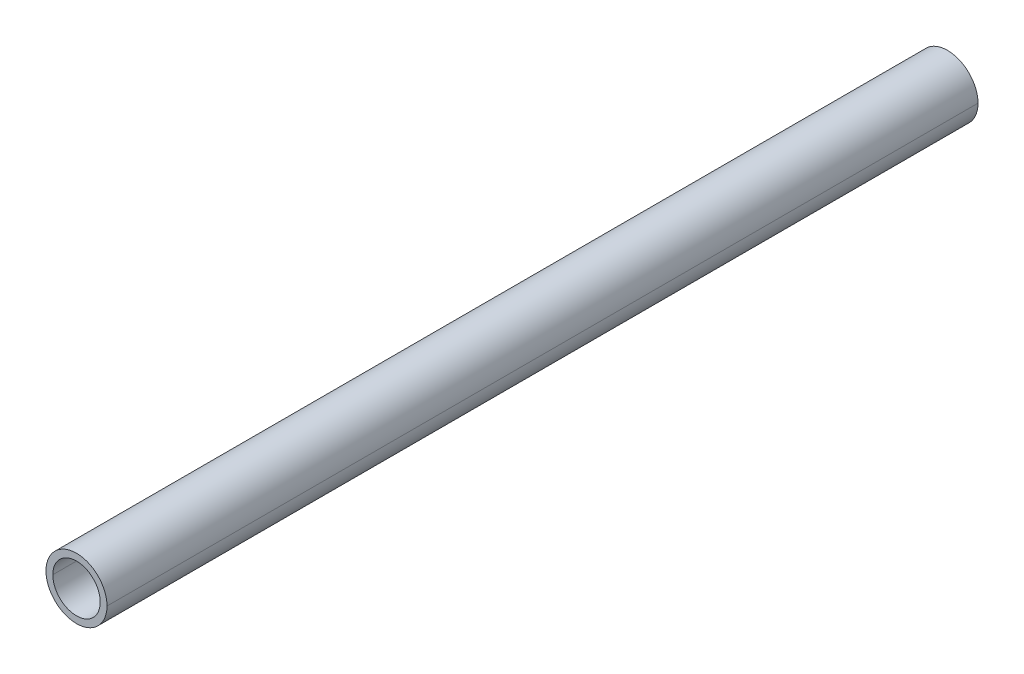
ISO-10303-21;
HEADER;
FILE_DESCRIPTION(('STEP AP214'),'2;1');
FILE_NAME('part.step','',(''),(''),'','','');
FILE_SCHEMA(('AUTOMOTIVE_DESIGN { 1 0 10303 214 1 1 1 1 }'));
ENDSEC;
DATA;
#1=APPLICATION_CONTEXT('core data for automotive mechanical design processes');
#2=APPLICATION_PROTOCOL_DEFINITION('international standard','automotive_design',2000,#1);
#3=PRODUCT_CONTEXT('',#1,'mechanical');
#4=PRODUCT('Part','Part','',(#3));
#5=PRODUCT_RELATED_PRODUCT_CATEGORY('part','',(#4));
#6=PRODUCT_DEFINITION_FORMATION('','',#4);
#7=PRODUCT_DEFINITION_CONTEXT('part definition',#1,'design');
#8=PRODUCT_DEFINITION('design','',#6,#7);
#9=PRODUCT_DEFINITION_SHAPE('','',#8);
#10=(LENGTH_UNIT() NAMED_UNIT(*) SI_UNIT(.MILLI.,.METRE.));
#11=(NAMED_UNIT(*) PLANE_ANGLE_UNIT() SI_UNIT($,.RADIAN.));
#12=(NAMED_UNIT(*) SI_UNIT($,.STERADIAN.) SOLID_ANGLE_UNIT());
#13=UNCERTAINTY_MEASURE_WITH_UNIT(LENGTH_MEASURE(1.E-05),#10,'distance_accuracy_value','');
#14=(GEOMETRIC_REPRESENTATION_CONTEXT(3) GLOBAL_UNCERTAINTY_ASSIGNED_CONTEXT((#13)) GLOBAL_UNIT_ASSIGNED_CONTEXT((#10,
#11,#12)) REPRESENTATION_CONTEXT('',''));
#15=CARTESIAN_POINT('',(0.,0.,0.));
#16=DIRECTION('',(0.,0.,1.));
#17=DIRECTION('',(1.,0.,0.));
#18=AXIS2_PLACEMENT_3D('',#15,#16,#17);
#19=CARTESIAN_POINT('',(0.,0.,257.));
#20=DIRECTION('',(0.,0.,-1.));
#21=DIRECTION('',(-1.,0.,0.));
#22=AXIS2_PLACEMENT_3D('',#19,#20,#21);
#23=CYLINDRICAL_SURFACE('',#22,7.);
#24=DIRECTION('',(0.,0.,-1.));
#25=VECTOR('',#24,1.);
#26=CARTESIAN_POINT('',(7.,0.,257.));
#27=LINE('',#26,#25);
#28=CARTESIAN_POINT('',(7.,0.,257.));
#29=VERTEX_POINT('',#28);
#30=CARTESIAN_POINT('',(7.,0.,0.));
#31=VERTEX_POINT('',#30);
#32=EDGE_CURVE('E73',#29,#31,#27,.T.);
#33=ORIENTED_EDGE('',*,*,#32,.F.);
#34=CARTESIAN_POINT('',(0.,0.,257.));
#35=DIRECTION('',(0.,0.,1.));
#36=DIRECTION('',(1.,0.,0.));
#37=AXIS2_PLACEMENT_3D('',#34,#35,#36);
#38=CIRCLE('',#37,7.);
#39=CARTESIAN_POINT('',(-7.,0.,257.));
#40=VERTEX_POINT('',#39);
#41=EDGE_CURVE('E101',#29,#40,#38,.T.);
#42=ORIENTED_EDGE('',*,*,#41,.T.);
#43=DIRECTION('',(0.,0.,-1.));
#44=VECTOR('',#43,1.);
#45=CARTESIAN_POINT('',(-7.,0.,257.));
#46=LINE('',#45,#44);
#47=CARTESIAN_POINT('',(-7.,0.,0.));
#48=VERTEX_POINT('',#47);
#49=EDGE_CURVE('E76',#40,#48,#46,.T.);
#50=ORIENTED_EDGE('',*,*,#49,.T.);
#51=CARTESIAN_POINT('',(0.,0.,0.));
#52=DIRECTION('',(0.,0.,1.));
#53=DIRECTION('',(1.,0.,0.));
#54=AXIS2_PLACEMENT_3D('',#51,#52,#53);
#55=CIRCLE('',#54,7.);
#56=EDGE_CURVE('E11',#31,#48,#55,.T.);
#57=ORIENTED_EDGE('',*,*,#56,.F.);
#58=EDGE_LOOP('',(#33,#42,#50,#57));
#59=FACE_BOUND('',#58,.T.);
#60=ADVANCED_FACE('F16',(#59),#23,.F.);
#61=CARTESIAN_POINT('',(0.,0.,257.));
#62=DIRECTION('',(0.,0.,-1.));
#63=DIRECTION('',(-1.,0.,0.));
#64=AXIS2_PLACEMENT_3D('',#61,#62,#63);
#65=CYLINDRICAL_SURFACE('',#64,9.);
#66=DIRECTION('',(0.,0.,-1.));
#67=VECTOR('',#66,1.);
#68=CARTESIAN_POINT('',(9.,0.,257.));
#69=LINE('',#68,#67);
#70=CARTESIAN_POINT('',(9.,0.,257.));
#71=VERTEX_POINT('',#70);
#72=CARTESIAN_POINT('',(9.,0.,0.));
#73=VERTEX_POINT('',#72);
#74=EDGE_CURVE('E96',#71,#73,#69,.T.);
#75=ORIENTED_EDGE('',*,*,#74,.F.);
#76=CARTESIAN_POINT('',(0.,0.,257.));
#77=DIRECTION('',(0.,0.,1.));
#78=DIRECTION('',(1.,0.,0.));
#79=AXIS2_PLACEMENT_3D('',#76,#77,#78);
#80=CIRCLE('',#79,9.);
#81=CARTESIAN_POINT('',(-9.,0.,257.));
#82=VERTEX_POINT('',#81);
#83=EDGE_CURVE('E104',#82,#71,#80,.T.);
#84=ORIENTED_EDGE('',*,*,#83,.F.);
#85=DIRECTION('',(0.,0.,-1.));
#86=VECTOR('',#85,1.);
#87=CARTESIAN_POINT('',(-9.,0.,257.));
#88=LINE('',#87,#86);
#89=CARTESIAN_POINT('',(-9.,0.,0.));
#90=VERTEX_POINT('',#89);
#91=EDGE_CURVE('E20',#82,#90,#88,.T.);
#92=ORIENTED_EDGE('',*,*,#91,.T.);
#93=CARTESIAN_POINT('',(0.,0.,0.));
#94=DIRECTION('',(0.,0.,1.));
#95=DIRECTION('',(1.,0.,0.));
#96=AXIS2_PLACEMENT_3D('',#93,#94,#95);
#97=CIRCLE('',#96,9.);
#98=EDGE_CURVE('E27',#90,#73,#97,.T.);
#99=ORIENTED_EDGE('',*,*,#98,.T.);
#100=EDGE_LOOP('',(#75,#84,#92,#99));
#101=FACE_BOUND('',#100,.T.);
#102=ADVANCED_FACE('F117',(#101),#65,.T.);
#103=CARTESIAN_POINT('',(0.,0.,0.));
#104=DIRECTION('',(0.,0.,1.));
#105=DIRECTION('',(1.,0.,0.));
#106=AXIS2_PLACEMENT_3D('',#103,#104,#105);
#107=PLANE('',#106);
#108=CARTESIAN_POINT('',(0.,0.,0.));
#109=DIRECTION('',(0.,0.,1.));
#110=DIRECTION('',(1.,0.,0.));
#111=AXIS2_PLACEMENT_3D('',#108,#109,#110);
#112=CIRCLE('',#111,7.);
#113=EDGE_CURVE('E78',#48,#31,#112,.T.);
#114=ORIENTED_EDGE('',*,*,#113,.T.);
#115=ORIENTED_EDGE('',*,*,#56,.T.);
#116=EDGE_LOOP('',(#114,#115));
#117=FACE_BOUND('',#116,.T.);
#118=ORIENTED_EDGE('',*,*,#98,.F.);
#119=CARTESIAN_POINT('',(0.,0.,0.));
#120=DIRECTION('',(0.,0.,1.));
#121=DIRECTION('',(1.,0.,0.));
#122=AXIS2_PLACEMENT_3D('',#119,#120,#121);
#123=CIRCLE('',#122,9.);
#124=EDGE_CURVE('E100',#73,#90,#123,.T.);
#125=ORIENTED_EDGE('',*,*,#124,.F.);
#126=EDGE_LOOP('',(#118,#125));
#127=FACE_BOUND('',#126,.T.);
#128=ADVANCED_FACE('F79',(#117,#127),#107,.F.);
#129=CARTESIAN_POINT('',(0.,0.,257.));
#130=DIRECTION('',(0.,0.,1.));
#131=DIRECTION('',(1.,0.,0.));
#132=AXIS2_PLACEMENT_3D('',#129,#130,#131);
#133=PLANE('',#132);
#134=CARTESIAN_POINT('',(0.,0.,257.));
#135=DIRECTION('',(0.,0.,1.));
#136=DIRECTION('',(1.,0.,0.));
#137=AXIS2_PLACEMENT_3D('',#134,#135,#136);
#138=CIRCLE('',#137,7.);
#139=EDGE_CURVE('E84',#40,#29,#138,.T.);
#140=ORIENTED_EDGE('',*,*,#139,.F.);
#141=ORIENTED_EDGE('',*,*,#41,.F.);
#142=EDGE_LOOP('',(#140,#141));
#143=FACE_BOUND('',#142,.T.);
#144=ORIENTED_EDGE('',*,*,#83,.T.);
#145=CARTESIAN_POINT('',(0.,0.,257.));
#146=DIRECTION('',(0.,0.,1.));
#147=DIRECTION('',(1.,0.,0.));
#148=AXIS2_PLACEMENT_3D('',#145,#146,#147);
#149=CIRCLE('',#148,9.);
#150=EDGE_CURVE('E93',#71,#82,#149,.T.);
#151=ORIENTED_EDGE('',*,*,#150,.T.);
#152=EDGE_LOOP('',(#144,#151));
#153=FACE_BOUND('',#152,.T.);
#154=ADVANCED_FACE('F122',(#143,#153),#133,.T.);
#155=CARTESIAN_POINT('',(0.,0.,257.));
#156=DIRECTION('',(0.,0.,-1.));
#157=DIRECTION('',(-1.,0.,0.));
#158=AXIS2_PLACEMENT_3D('',#155,#156,#157);
#159=CYLINDRICAL_SURFACE('',#158,9.);
#160=ORIENTED_EDGE('',*,*,#150,.F.);
#161=ORIENTED_EDGE('',*,*,#74,.T.);
#162=ORIENTED_EDGE('',*,*,#124,.T.);
#163=ORIENTED_EDGE('',*,*,#91,.F.);
#164=EDGE_LOOP('',(#160,#161,#162,#163));
#165=FACE_BOUND('',#164,.T.);
#166=ADVANCED_FACE('F18',(#165),#159,.T.);
#167=CARTESIAN_POINT('',(0.,0.,257.));
#168=DIRECTION('',(0.,0.,-1.));
#169=DIRECTION('',(-1.,0.,0.));
#170=AXIS2_PLACEMENT_3D('',#167,#168,#169);
#171=CYLINDRICAL_SURFACE('',#170,7.);
#172=ORIENTED_EDGE('',*,*,#139,.T.);
#173=ORIENTED_EDGE('',*,*,#32,.T.);
#174=ORIENTED_EDGE('',*,*,#113,.F.);
#175=ORIENTED_EDGE('',*,*,#49,.F.);
#176=EDGE_LOOP('',(#172,#173,#174,#175));
#177=FACE_BOUND('',#176,.T.);
#178=ADVANCED_FACE('F82',(#177),#171,.F.);
#179=CLOSED_SHELL('',(#60,#102,#128,#154,#166,#178));
#180=MANIFOLD_SOLID_BREP('B1',#179);
#181=ADVANCED_BREP_SHAPE_REPRESENTATION('',(#18,#180),#14);
#182=SHAPE_DEFINITION_REPRESENTATION(#9,#181);
ENDSEC;
END-ISO-10303-21;
